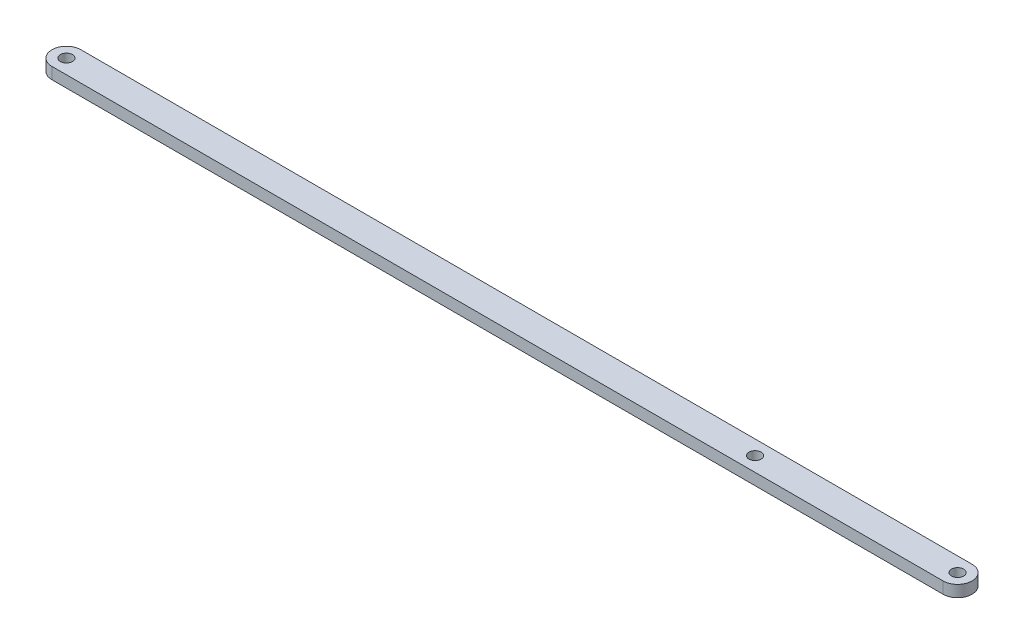
ISO-10303-21;
HEADER;
FILE_DESCRIPTION(('STEP AP214'),'2;1');
FILE_NAME('part.step','',(''),(''),'','','');
FILE_SCHEMA(('AUTOMOTIVE_DESIGN { 1 0 10303 214 1 1 1 1 }'));
ENDSEC;
DATA;
#1=APPLICATION_CONTEXT('core data for automotive mechanical design processes');
#2=APPLICATION_PROTOCOL_DEFINITION('international standard','automotive_design',2000,#1);
#3=PRODUCT_CONTEXT('',#1,'mechanical');
#4=PRODUCT('Part','Part','',(#3));
#5=PRODUCT_RELATED_PRODUCT_CATEGORY('part','',(#4));
#6=PRODUCT_DEFINITION_FORMATION('','',#4);
#7=PRODUCT_DEFINITION_CONTEXT('part definition',#1,'design');
#8=PRODUCT_DEFINITION('design','',#6,#7);
#9=PRODUCT_DEFINITION_SHAPE('','',#8);
#10=(LENGTH_UNIT() NAMED_UNIT(*) SI_UNIT(.MILLI.,.METRE.));
#11=(NAMED_UNIT(*) PLANE_ANGLE_UNIT() SI_UNIT($,.RADIAN.));
#12=(NAMED_UNIT(*) SI_UNIT($,.STERADIAN.) SOLID_ANGLE_UNIT());
#13=UNCERTAINTY_MEASURE_WITH_UNIT(LENGTH_MEASURE(1.E-05),#10,'distance_accuracy_value','');
#14=(GEOMETRIC_REPRESENTATION_CONTEXT(3) GLOBAL_UNCERTAINTY_ASSIGNED_CONTEXT((#13)) GLOBAL_UNIT_ASSIGNED_CONTEXT((#10,
#11,#12)) REPRESENTATION_CONTEXT('',''));
#15=CARTESIAN_POINT('',(0.,0.,0.));
#16=DIRECTION('',(0.,0.,1.));
#17=DIRECTION('',(1.,0.,0.));
#18=AXIS2_PLACEMENT_3D('',#15,#16,#17);
#19=CARTESIAN_POINT('',(0.,2.,0.));
#20=DIRECTION('',(0.,1.,0.));
#21=DIRECTION('',(0.,0.,1.));
#22=AXIS2_PLACEMENT_3D('',#19,#20,#21);
#23=PLANE('',#22);
#24=CARTESIAN_POINT('',(154.,2.,0.));
#25=DIRECTION('',(0.,1.,0.));
#26=DIRECTION('',(0.,0.,1.));
#27=AXIS2_PLACEMENT_3D('',#24,#25,#26);
#28=CIRCLE('',#27,1.04999999999999);
#29=CARTESIAN_POINT('',(154.,2.,1.04999999999999));
#30=VERTEX_POINT('',#29);
#31=EDGE_CURVE('E120',#30,#30,#28,.T.);
#32=ORIENTED_EDGE('',*,*,#31,.F.);
#33=EDGE_LOOP('',(#32));
#34=FACE_BOUND('',#33,.T.);
#35=CARTESIAN_POINT('',(0.,2.,0.));
#36=DIRECTION('',(0.,1.,0.));
#37=DIRECTION('',(0.,0.,1.));
#38=AXIS2_PLACEMENT_3D('',#35,#36,#37);
#39=CIRCLE('',#38,2.5);
#40=CARTESIAN_POINT('',(0.,2.,-2.5));
#41=VERTEX_POINT('',#40);
#42=CARTESIAN_POINT('',(0.,2.,2.5));
#43=VERTEX_POINT('',#42);
#44=EDGE_CURVE('E90',#41,#43,#39,.T.);
#45=ORIENTED_EDGE('',*,*,#44,.T.);
#46=DIRECTION('',(1.,0.,0.));
#47=VECTOR('',#46,1.);
#48=CARTESIAN_POINT('',(0.,2.,2.5));
#49=LINE('',#48,#47);
#50=CARTESIAN_POINT('',(154.,2.,2.5));
#51=VERTEX_POINT('',#50);
#52=EDGE_CURVE('E85',#43,#51,#49,.T.);
#53=ORIENTED_EDGE('',*,*,#52,.T.);
#54=CARTESIAN_POINT('',(154.,2.,0.));
#55=DIRECTION('',(0.,1.,0.));
#56=DIRECTION('',(0.,0.,1.));
#57=AXIS2_PLACEMENT_3D('',#54,#55,#56);
#58=CIRCLE('',#57,2.5);
#59=CARTESIAN_POINT('',(154.,2.,-2.5));
#60=VERTEX_POINT('',#59);
#61=EDGE_CURVE('E88',#51,#60,#58,.T.);
#62=ORIENTED_EDGE('',*,*,#61,.T.);
#63=DIRECTION('',(-1.,0.,0.));
#64=VECTOR('',#63,1.);
#65=CARTESIAN_POINT('',(0.,2.,-2.5));
#66=LINE('',#65,#64);
#67=EDGE_CURVE('E55',#60,#41,#66,.T.);
#68=ORIENTED_EDGE('',*,*,#67,.T.);
#69=EDGE_LOOP('',(#45,#53,#62,#68));
#70=FACE_BOUND('',#69,.T.);
#71=CARTESIAN_POINT('',(0.,2.,0.));
#72=DIRECTION('',(0.,1.,0.));
#73=DIRECTION('',(0.,0.,1.));
#74=AXIS2_PLACEMENT_3D('',#71,#72,#73);
#75=CIRCLE('',#74,1.05);
#76=CARTESIAN_POINT('',(0.,2.,1.05));
#77=VERTEX_POINT('',#76);
#78=EDGE_CURVE('E105',#77,#77,#75,.T.);
#79=ORIENTED_EDGE('',*,*,#78,.F.);
#80=EDGE_LOOP('',(#79));
#81=FACE_BOUND('',#80,.T.);
#82=CARTESIAN_POINT('',(119.,2.,0.));
#83=DIRECTION('',(0.,1.,0.));
#84=DIRECTION('',(0.,0.,1.));
#85=AXIS2_PLACEMENT_3D('',#82,#83,#84);
#86=CIRCLE('',#85,1.04999999999999);
#87=CARTESIAN_POINT('',(119.,2.,1.04999999999999));
#88=VERTEX_POINT('',#87);
#89=EDGE_CURVE('E126',#88,#88,#86,.T.);
#90=ORIENTED_EDGE('',*,*,#89,.F.);
#91=EDGE_LOOP('',(#90));
#92=FACE_BOUND('',#91,.T.);
#93=ADVANCED_FACE('F38',(#34,#70,#81,#92),#23,.T.);
#94=CARTESIAN_POINT('',(0.,0.,0.));
#95=DIRECTION('',(0.,1.,0.));
#96=DIRECTION('',(0.,0.,1.));
#97=AXIS2_PLACEMENT_3D('',#94,#95,#96);
#98=PLANE('',#97);
#99=CARTESIAN_POINT('',(0.,0.,0.));
#100=DIRECTION('',(0.,1.,0.));
#101=DIRECTION('',(0.,0.,1.));
#102=AXIS2_PLACEMENT_3D('',#99,#100,#101);
#103=CIRCLE('',#102,2.5);
#104=CARTESIAN_POINT('',(0.,0.,-2.5));
#105=VERTEX_POINT('',#104);
#106=CARTESIAN_POINT('',(0.,0.,2.5));
#107=VERTEX_POINT('',#106);
#108=EDGE_CURVE('E102',#105,#107,#103,.T.);
#109=ORIENTED_EDGE('',*,*,#108,.F.);
#110=DIRECTION('',(-1.,0.,0.));
#111=VECTOR('',#110,1.);
#112=CARTESIAN_POINT('',(0.,0.,-2.5));
#113=LINE('',#112,#111);
#114=CARTESIAN_POINT('',(154.,0.,-2.5));
#115=VERTEX_POINT('',#114);
#116=EDGE_CURVE('E78',#115,#105,#113,.T.);
#117=ORIENTED_EDGE('',*,*,#116,.F.);
#118=CARTESIAN_POINT('',(154.,0.,0.));
#119=DIRECTION('',(0.,1.,0.));
#120=DIRECTION('',(0.,0.,1.));
#121=AXIS2_PLACEMENT_3D('',#118,#119,#120);
#122=CIRCLE('',#121,2.5);
#123=CARTESIAN_POINT('',(154.,0.,2.5));
#124=VERTEX_POINT('',#123);
#125=EDGE_CURVE('E72',#124,#115,#122,.T.);
#126=ORIENTED_EDGE('',*,*,#125,.F.);
#127=DIRECTION('',(1.,0.,0.));
#128=VECTOR('',#127,1.);
#129=CARTESIAN_POINT('',(0.,0.,2.5));
#130=LINE('',#129,#128);
#131=EDGE_CURVE('E94',#107,#124,#130,.T.);
#132=ORIENTED_EDGE('',*,*,#131,.F.);
#133=EDGE_LOOP('',(#109,#117,#126,#132));
#134=FACE_BOUND('',#133,.T.);
#135=CARTESIAN_POINT('',(0.,0.,0.));
#136=DIRECTION('',(0.,1.,0.));
#137=DIRECTION('',(0.,0.,1.));
#138=AXIS2_PLACEMENT_3D('',#135,#136,#137);
#139=CIRCLE('',#138,1.05);
#140=CARTESIAN_POINT('',(0.,0.,1.05));
#141=VERTEX_POINT('',#140);
#142=EDGE_CURVE('E117',#141,#141,#139,.T.);
#143=ORIENTED_EDGE('',*,*,#142,.T.);
#144=EDGE_LOOP('',(#143));
#145=FACE_BOUND('',#144,.T.);
#146=CARTESIAN_POINT('',(154.,0.,0.));
#147=DIRECTION('',(0.,1.,0.));
#148=DIRECTION('',(0.,0.,1.));
#149=AXIS2_PLACEMENT_3D('',#146,#147,#148);
#150=CIRCLE('',#149,1.04999999999999);
#151=CARTESIAN_POINT('',(154.,0.,1.04999999999999));
#152=VERTEX_POINT('',#151);
#153=EDGE_CURVE('E123',#152,#152,#150,.T.);
#154=ORIENTED_EDGE('',*,*,#153,.T.);
#155=EDGE_LOOP('',(#154));
#156=FACE_BOUND('',#155,.T.);
#157=CARTESIAN_POINT('',(119.,0.,0.));
#158=DIRECTION('',(0.,1.,0.));
#159=DIRECTION('',(0.,0.,1.));
#160=AXIS2_PLACEMENT_3D('',#157,#158,#159);
#161=CIRCLE('',#160,1.04999999999999);
#162=CARTESIAN_POINT('',(119.,0.,1.04999999999999));
#163=VERTEX_POINT('',#162);
#164=EDGE_CURVE('E129',#163,#163,#161,.T.);
#165=ORIENTED_EDGE('',*,*,#164,.T.);
#166=EDGE_LOOP('',(#165));
#167=FACE_BOUND('',#166,.T.);
#168=ADVANCED_FACE('F113',(#134,#145,#156,#167),#98,.F.);
#169=CARTESIAN_POINT('',(0.,2.,0.));
#170=DIRECTION('',(0.,-1.,0.));
#171=DIRECTION('',(0.,0.,-1.));
#172=AXIS2_PLACEMENT_3D('',#169,#170,#171);
#173=CYLINDRICAL_SURFACE('',#172,2.5);
#174=ORIENTED_EDGE('',*,*,#108,.T.);
#175=DIRECTION('',(0.,-1.,0.));
#176=VECTOR('',#175,1.);
#177=CARTESIAN_POINT('',(0.,2.,2.5));
#178=LINE('',#177,#176);
#179=EDGE_CURVE('E11',#43,#107,#178,.T.);
#180=ORIENTED_EDGE('',*,*,#179,.F.);
#181=ORIENTED_EDGE('',*,*,#44,.F.);
#182=DIRECTION('',(0.,-1.,0.));
#183=VECTOR('',#182,1.);
#184=CARTESIAN_POINT('',(0.,2.,-2.5));
#185=LINE('',#184,#183);
#186=EDGE_CURVE('E98',#41,#105,#185,.T.);
#187=ORIENTED_EDGE('',*,*,#186,.T.);
#188=EDGE_LOOP('',(#174,#180,#181,#187));
#189=FACE_BOUND('',#188,.T.);
#190=ADVANCED_FACE('F40',(#189),#173,.T.);
#191=CARTESIAN_POINT('',(0.,2.,2.5));
#192=DIRECTION('',(0.,0.,-1.));
#193=DIRECTION('',(-1.,0.,0.));
#194=AXIS2_PLACEMENT_3D('',#191,#192,#193);
#195=PLANE('',#194);
#196=ORIENTED_EDGE('',*,*,#131,.T.);
#197=DIRECTION('',(0.,-1.,0.));
#198=VECTOR('',#197,1.);
#199=CARTESIAN_POINT('',(154.,2.,2.5));
#200=LINE('',#199,#198);
#201=EDGE_CURVE('E47',#51,#124,#200,.T.);
#202=ORIENTED_EDGE('',*,*,#201,.F.);
#203=ORIENTED_EDGE('',*,*,#52,.F.);
#204=ORIENTED_EDGE('',*,*,#179,.T.);
#205=EDGE_LOOP('',(#196,#202,#203,#204));
#206=FACE_BOUND('',#205,.T.);
#207=ADVANCED_FACE('F93',(#206),#195,.F.);
#208=CARTESIAN_POINT('',(154.,2.,0.));
#209=DIRECTION('',(0.,-1.,0.));
#210=DIRECTION('',(0.,0.,-1.));
#211=AXIS2_PLACEMENT_3D('',#208,#209,#210);
#212=CYLINDRICAL_SURFACE('',#211,2.5);
#213=ORIENTED_EDGE('',*,*,#125,.T.);
#214=DIRECTION('',(0.,-1.,0.));
#215=VECTOR('',#214,1.);
#216=CARTESIAN_POINT('',(154.,2.,-2.5));
#217=LINE('',#216,#215);
#218=EDGE_CURVE('E95',#60,#115,#217,.T.);
#219=ORIENTED_EDGE('',*,*,#218,.F.);
#220=ORIENTED_EDGE('',*,*,#61,.F.);
#221=ORIENTED_EDGE('',*,*,#201,.T.);
#222=EDGE_LOOP('',(#213,#219,#220,#221));
#223=FACE_BOUND('',#222,.T.);
#224=ADVANCED_FACE('F96',(#223),#212,.T.);
#225=CARTESIAN_POINT('',(0.,2.,-2.5));
#226=DIRECTION('',(0.,0.,1.));
#227=DIRECTION('',(1.,0.,0.));
#228=AXIS2_PLACEMENT_3D('',#225,#226,#227);
#229=PLANE('',#228);
#230=ORIENTED_EDGE('',*,*,#116,.T.);
#231=ORIENTED_EDGE('',*,*,#186,.F.);
#232=ORIENTED_EDGE('',*,*,#67,.F.);
#233=ORIENTED_EDGE('',*,*,#218,.T.);
#234=EDGE_LOOP('',(#230,#231,#232,#233));
#235=FACE_BOUND('',#234,.T.);
#236=ADVANCED_FACE('F110',(#235),#229,.F.);
#237=CARTESIAN_POINT('',(0.,2.,0.));
#238=DIRECTION('',(0.,-1.,0.));
#239=DIRECTION('',(0.,0.,-1.));
#240=AXIS2_PLACEMENT_3D('',#237,#238,#239);
#241=CYLINDRICAL_SURFACE('',#240,1.05);
#242=ORIENTED_EDGE('',*,*,#78,.T.);
#243=EDGE_LOOP('',(#242));
#244=FACE_BOUND('',#243,.T.);
#245=ORIENTED_EDGE('',*,*,#142,.F.);
#246=EDGE_LOOP('',(#245));
#247=FACE_BOUND('',#246,.T.);
#248=ADVANCED_FACE('F147',(#244,#247),#241,.F.);
#249=CARTESIAN_POINT('',(154.,2.,0.));
#250=DIRECTION('',(0.,-1.,0.));
#251=DIRECTION('',(0.,0.,-1.));
#252=AXIS2_PLACEMENT_3D('',#249,#250,#251);
#253=CYLINDRICAL_SURFACE('',#252,1.04999999999999);
#254=ORIENTED_EDGE('',*,*,#31,.T.);
#255=EDGE_LOOP('',(#254));
#256=FACE_BOUND('',#255,.T.);
#257=ORIENTED_EDGE('',*,*,#153,.F.);
#258=EDGE_LOOP('',(#257));
#259=FACE_BOUND('',#258,.T.);
#260=ADVANCED_FACE('F201',(#256,#259),#253,.F.);
#261=CARTESIAN_POINT('',(119.,2.,0.));
#262=DIRECTION('',(0.,-1.,0.));
#263=DIRECTION('',(0.,0.,-1.));
#264=AXIS2_PLACEMENT_3D('',#261,#262,#263);
#265=CYLINDRICAL_SURFACE('',#264,1.04999999999999);
#266=ORIENTED_EDGE('',*,*,#89,.T.);
#267=EDGE_LOOP('',(#266));
#268=FACE_BOUND('',#267,.T.);
#269=ORIENTED_EDGE('',*,*,#164,.F.);
#270=EDGE_LOOP('',(#269));
#271=FACE_BOUND('',#270,.T.);
#272=ADVANCED_FACE('F135',(#268,#271),#265,.F.);
#273=CLOSED_SHELL('',(#93,#168,#190,#207,#224,#236,#248,#260,#272));
#274=MANIFOLD_SOLID_BREP('B2',#273);
#275=ADVANCED_BREP_SHAPE_REPRESENTATION('',(#18,#274),#14);
#276=SHAPE_DEFINITION_REPRESENTATION(#9,#275);
ENDSEC;
END-ISO-10303-21;
